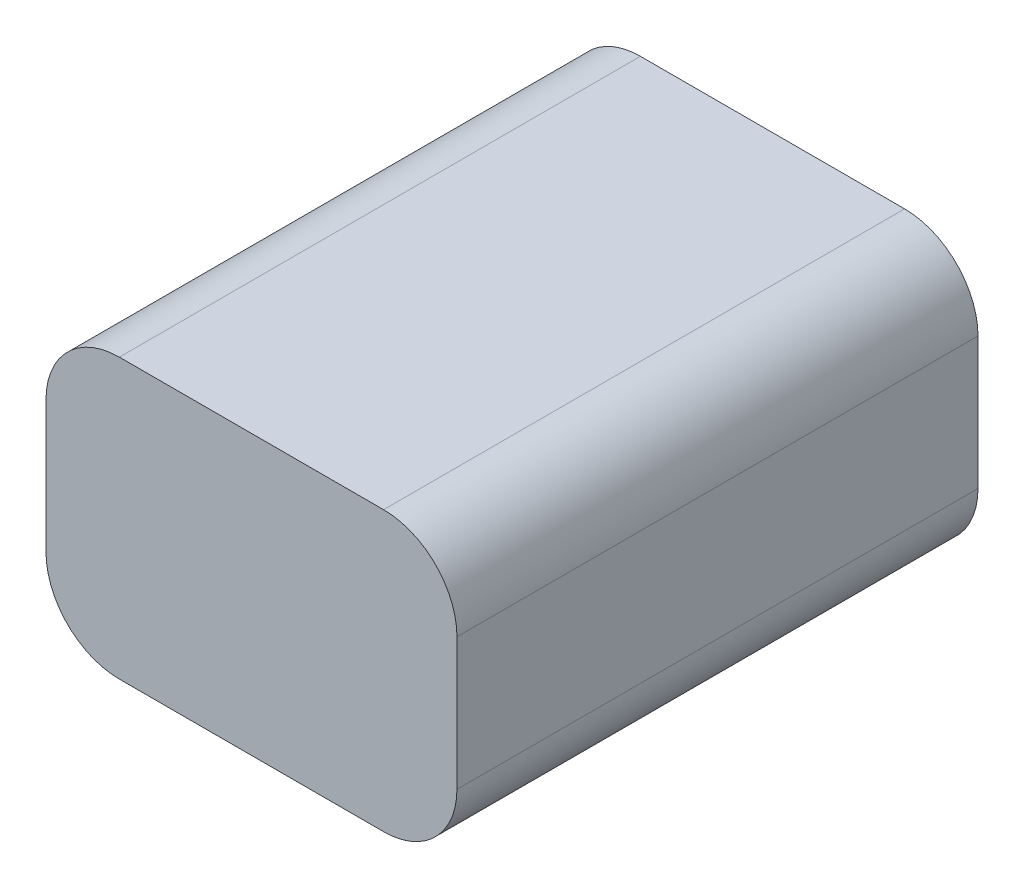
ISO-10303-21;
HEADER;
FILE_DESCRIPTION(('STEP AP214'),'2;1');
FILE_NAME('part.step','',(''),(''),'','','');
FILE_SCHEMA(('AUTOMOTIVE_DESIGN { 1 0 10303 214 1 1 1 1 }'));
ENDSEC;
DATA;
#1=APPLICATION_CONTEXT('core data for automotive mechanical design processes');
#2=APPLICATION_PROTOCOL_DEFINITION('international standard','automotive_design',2000,#1);
#3=PRODUCT_CONTEXT('',#1,'mechanical');
#4=PRODUCT('Part','Part','',(#3));
#5=PRODUCT_RELATED_PRODUCT_CATEGORY('part','',(#4));
#6=PRODUCT_DEFINITION_FORMATION('','',#4);
#7=PRODUCT_DEFINITION_CONTEXT('part definition',#1,'design');
#8=PRODUCT_DEFINITION('design','',#6,#7);
#9=PRODUCT_DEFINITION_SHAPE('','',#8);
#10=(LENGTH_UNIT() NAMED_UNIT(*) SI_UNIT(.MILLI.,.METRE.));
#11=(NAMED_UNIT(*) PLANE_ANGLE_UNIT() SI_UNIT($,.RADIAN.));
#12=(NAMED_UNIT(*) SI_UNIT($,.STERADIAN.) SOLID_ANGLE_UNIT());
#13=UNCERTAINTY_MEASURE_WITH_UNIT(LENGTH_MEASURE(1.E-05),#10,'distance_accuracy_value','');
#14=(GEOMETRIC_REPRESENTATION_CONTEXT(3) GLOBAL_UNCERTAINTY_ASSIGNED_CONTEXT((#13)) GLOBAL_UNIT_ASSIGNED_CONTEXT((#10,
#11,#12)) REPRESENTATION_CONTEXT('',''));
#15=CARTESIAN_POINT('',(0.,0.,0.));
#16=DIRECTION('',(0.,0.,1.));
#17=DIRECTION('',(1.,0.,0.));
#18=AXIS2_PLACEMENT_3D('',#15,#16,#17);
#19=CARTESIAN_POINT('',(0.,0.,71.));
#20=DIRECTION('',(1.,0.,0.));
#21=DIRECTION('',(0.,0.,-1.));
#22=AXIS2_PLACEMENT_3D('',#19,#20,#21);
#23=PLANE('',#22);
#24=DIRECTION('',(0.,-1.,0.));
#25=VECTOR('',#24,1.);
#26=CARTESIAN_POINT('',(0.,0.,0.));
#27=LINE('',#26,#25);
#28=CARTESIAN_POINT('',(0.,28.,0.));
#29=VERTEX_POINT('',#28);
#30=CARTESIAN_POINT('',(0.,10.,0.));
#31=VERTEX_POINT('',#30);
#32=EDGE_CURVE('E136',#29,#31,#27,.T.);
#33=ORIENTED_EDGE('',*,*,#32,.T.);
#34=DIRECTION('',(0.,0.,-1.));
#35=VECTOR('',#34,1.);
#36=CARTESIAN_POINT('',(0.,10.,71.));
#37=LINE('',#36,#35);
#38=CARTESIAN_POINT('',(0.,10.,71.));
#39=VERTEX_POINT('',#38);
#40=EDGE_CURVE('E159',#31,#39,#37,.F.);
#41=ORIENTED_EDGE('',*,*,#40,.T.);
#42=DIRECTION('',(0.,-1.,0.));
#43=VECTOR('',#42,1.);
#44=CARTESIAN_POINT('',(0.,0.,71.));
#45=LINE('',#44,#43);
#46=CARTESIAN_POINT('',(0.,28.,71.));
#47=VERTEX_POINT('',#46);
#48=EDGE_CURVE('E134',#47,#39,#45,.T.);
#49=ORIENTED_EDGE('',*,*,#48,.F.);
#50=DIRECTION('',(0.,0.,-1.));
#51=VECTOR('',#50,1.);
#52=CARTESIAN_POINT('',(0.,28.,71.));
#53=LINE('',#52,#51);
#54=EDGE_CURVE('E156',#47,#29,#53,.T.);
#55=ORIENTED_EDGE('',*,*,#54,.T.);
#56=EDGE_LOOP('',(#33,#41,#49,#55));
#57=FACE_BOUND('',#56,.T.);
#58=ADVANCED_FACE('F41',(#57),#23,.F.);
#59=CARTESIAN_POINT('',(0.,0.,71.));
#60=DIRECTION('',(0.,1.,0.));
#61=DIRECTION('',(0.,0.,1.));
#62=AXIS2_PLACEMENT_3D('',#59,#60,#61);
#63=PLANE('',#62);
#64=DIRECTION('',(1.,0.,0.));
#65=VECTOR('',#64,1.);
#66=CARTESIAN_POINT('',(0.,0.,0.));
#67=LINE('',#66,#65);
#68=CARTESIAN_POINT('',(10.,0.,0.));
#69=VERTEX_POINT('',#68);
#70=CARTESIAN_POINT('',(46.,0.,0.));
#71=VERTEX_POINT('',#70);
#72=EDGE_CURVE('E132',#69,#71,#67,.T.);
#73=ORIENTED_EDGE('',*,*,#72,.T.);
#74=DIRECTION('',(0.,0.,-1.));
#75=VECTOR('',#74,1.);
#76=CARTESIAN_POINT('',(46.,0.,71.));
#77=LINE('',#76,#75);
#78=CARTESIAN_POINT('',(46.,0.,71.));
#79=VERTEX_POINT('',#78);
#80=EDGE_CURVE('E111',#71,#79,#77,.F.);
#81=ORIENTED_EDGE('',*,*,#80,.T.);
#82=DIRECTION('',(1.,0.,0.));
#83=VECTOR('',#82,1.);
#84=CARTESIAN_POINT('',(0.,0.,71.));
#85=LINE('',#84,#83);
#86=CARTESIAN_POINT('',(10.,0.,71.));
#87=VERTEX_POINT('',#86);
#88=EDGE_CURVE('E175',#87,#79,#85,.T.);
#89=ORIENTED_EDGE('',*,*,#88,.F.);
#90=DIRECTION('',(0.,0.,-1.));
#91=VECTOR('',#90,1.);
#92=CARTESIAN_POINT('',(10.,0.,71.));
#93=LINE('',#92,#91);
#94=EDGE_CURVE('E116',#87,#69,#93,.T.);
#95=ORIENTED_EDGE('',*,*,#94,.T.);
#96=EDGE_LOOP('',(#73,#81,#89,#95));
#97=FACE_BOUND('',#96,.T.);
#98=ADVANCED_FACE('F192',(#97),#63,.F.);
#99=CARTESIAN_POINT('',(56.,0.,71.));
#100=DIRECTION('',(-1.,0.,0.));
#101=DIRECTION('',(0.,0.,1.));
#102=AXIS2_PLACEMENT_3D('',#99,#100,#101);
#103=PLANE('',#102);
#104=DIRECTION('',(0.,1.,0.));
#105=VECTOR('',#104,1.);
#106=CARTESIAN_POINT('',(56.,0.,71.));
#107=LINE('',#106,#105);
#108=CARTESIAN_POINT('',(56.,10.,71.));
#109=VERTEX_POINT('',#108);
#110=CARTESIAN_POINT('',(56.,28.,71.));
#111=VERTEX_POINT('',#110);
#112=EDGE_CURVE('E125',#109,#111,#107,.T.);
#113=ORIENTED_EDGE('',*,*,#112,.F.);
#114=DIRECTION('',(0.,0.,-1.));
#115=VECTOR('',#114,1.);
#116=CARTESIAN_POINT('',(56.,10.,71.));
#117=LINE('',#116,#115);
#118=CARTESIAN_POINT('',(56.,10.,0.));
#119=VERTEX_POINT('',#118);
#120=EDGE_CURVE('E110',#109,#119,#117,.T.);
#121=ORIENTED_EDGE('',*,*,#120,.T.);
#122=DIRECTION('',(0.,1.,0.));
#123=VECTOR('',#122,1.);
#124=CARTESIAN_POINT('',(56.,0.,0.));
#125=LINE('',#124,#123);
#126=CARTESIAN_POINT('',(56.,28.,0.));
#127=VERTEX_POINT('',#126);
#128=EDGE_CURVE('E123',#119,#127,#125,.T.);
#129=ORIENTED_EDGE('',*,*,#128,.T.);
#130=DIRECTION('',(0.,0.,-1.));
#131=VECTOR('',#130,1.);
#132=CARTESIAN_POINT('',(56.,28.,71.));
#133=LINE('',#132,#131);
#134=EDGE_CURVE('E127',#127,#111,#133,.F.);
#135=ORIENTED_EDGE('',*,*,#134,.T.);
#136=EDGE_LOOP('',(#113,#121,#129,#135));
#137=FACE_BOUND('',#136,.T.);
#138=ADVANCED_FACE('F122',(#137),#103,.F.);
#139=CARTESIAN_POINT('',(0.,38.,71.));
#140=DIRECTION('',(0.,-1.,0.));
#141=DIRECTION('',(0.,0.,-1.));
#142=AXIS2_PLACEMENT_3D('',#139,#140,#141);
#143=PLANE('',#142);
#144=DIRECTION('',(-1.,0.,0.));
#145=VECTOR('',#144,1.);
#146=CARTESIAN_POINT('',(0.,38.,0.));
#147=LINE('',#146,#145);
#148=CARTESIAN_POINT('',(46.,38.,0.));
#149=VERTEX_POINT('',#148);
#150=CARTESIAN_POINT('',(10.,38.,0.));
#151=VERTEX_POINT('',#150);
#152=EDGE_CURVE('E131',#149,#151,#147,.T.);
#153=ORIENTED_EDGE('',*,*,#152,.T.);
#154=DIRECTION('',(0.,0.,-1.));
#155=VECTOR('',#154,1.);
#156=CARTESIAN_POINT('',(10.,38.,71.));
#157=LINE('',#156,#155);
#158=CARTESIAN_POINT('',(10.,38.,71.));
#159=VERTEX_POINT('',#158);
#160=EDGE_CURVE('E11',#151,#159,#157,.F.);
#161=ORIENTED_EDGE('',*,*,#160,.T.);
#162=DIRECTION('',(-1.,0.,0.));
#163=VECTOR('',#162,1.);
#164=CARTESIAN_POINT('',(0.,38.,71.));
#165=LINE('',#164,#163);
#166=CARTESIAN_POINT('',(46.,38.,71.));
#167=VERTEX_POINT('',#166);
#168=EDGE_CURVE('E140',#167,#159,#165,.T.);
#169=ORIENTED_EDGE('',*,*,#168,.F.);
#170=DIRECTION('',(0.,0.,-1.));
#171=VECTOR('',#170,1.);
#172=CARTESIAN_POINT('',(46.,38.,71.));
#173=LINE('',#172,#171);
#174=EDGE_CURVE('E49',#167,#149,#173,.T.);
#175=ORIENTED_EDGE('',*,*,#174,.T.);
#176=EDGE_LOOP('',(#153,#161,#169,#175));
#177=FACE_BOUND('',#176,.T.);
#178=ADVANCED_FACE('F162',(#177),#143,.F.);
#179=CARTESIAN_POINT('',(0.,0.,71.));
#180=DIRECTION('',(0.,0.,-1.));
#181=DIRECTION('',(-1.,0.,0.));
#182=AXIS2_PLACEMENT_3D('',#179,#180,#181);
#183=PLANE('',#182);
#184=ORIENTED_EDGE('',*,*,#88,.T.);
#185=CARTESIAN_POINT('',(46.,10.,71.));
#186=DIRECTION('',(0.,0.,-1.));
#187=DIRECTION('',(-1.,0.,0.));
#188=AXIS2_PLACEMENT_3D('',#185,#186,#187);
#189=CIRCLE('',#188,10.);
#190=EDGE_CURVE('E154',#79,#109,#189,.F.);
#191=ORIENTED_EDGE('',*,*,#190,.T.);
#192=ORIENTED_EDGE('',*,*,#112,.T.);
#193=CARTESIAN_POINT('',(46.,28.,71.));
#194=DIRECTION('',(0.,0.,-1.));
#195=DIRECTION('',(-1.,0.,0.));
#196=AXIS2_PLACEMENT_3D('',#193,#194,#195);
#197=CIRCLE('',#196,10.);
#198=EDGE_CURVE('E61',#111,#167,#197,.F.);
#199=ORIENTED_EDGE('',*,*,#198,.T.);
#200=ORIENTED_EDGE('',*,*,#168,.T.);
#201=CARTESIAN_POINT('',(10.,28.,71.));
#202=DIRECTION('',(0.,0.,-1.));
#203=DIRECTION('',(-1.,0.,0.));
#204=AXIS2_PLACEMENT_3D('',#201,#202,#203);
#205=CIRCLE('',#204,10.);
#206=EDGE_CURVE('E150',#159,#47,#205,.F.);
#207=ORIENTED_EDGE('',*,*,#206,.T.);
#208=ORIENTED_EDGE('',*,*,#48,.T.);
#209=CARTESIAN_POINT('',(10.,10.,71.));
#210=DIRECTION('',(0.,0.,-1.));
#211=DIRECTION('',(-1.,0.,0.));
#212=AXIS2_PLACEMENT_3D('',#209,#210,#211);
#213=CIRCLE('',#212,10.);
#214=EDGE_CURVE('E152',#39,#87,#213,.F.);
#215=ORIENTED_EDGE('',*,*,#214,.T.);
#216=EDGE_LOOP('',(#184,#191,#192,#199,#200,#207,#208,#215));
#217=FACE_BOUND('',#216,.T.);
#218=ADVANCED_FACE('F181',(#217),#183,.F.);
#219=CARTESIAN_POINT('',(0.,0.,0.));
#220=DIRECTION('',(0.,0.,-1.));
#221=DIRECTION('',(-1.,0.,0.));
#222=AXIS2_PLACEMENT_3D('',#219,#220,#221);
#223=PLANE('',#222);
#224=ORIENTED_EDGE('',*,*,#128,.F.);
#225=CARTESIAN_POINT('',(46.,10.,0.));
#226=DIRECTION('',(0.,0.,-1.));
#227=DIRECTION('',(-1.,0.,0.));
#228=AXIS2_PLACEMENT_3D('',#225,#226,#227);
#229=CIRCLE('',#228,10.);
#230=EDGE_CURVE('E106',#119,#71,#229,.T.);
#231=ORIENTED_EDGE('',*,*,#230,.T.);
#232=ORIENTED_EDGE('',*,*,#72,.F.);
#233=CARTESIAN_POINT('',(10.,10.,0.));
#234=DIRECTION('',(0.,0.,-1.));
#235=DIRECTION('',(-1.,0.,0.));
#236=AXIS2_PLACEMENT_3D('',#233,#234,#235);
#237=CIRCLE('',#236,10.);
#238=EDGE_CURVE('E117',#69,#31,#237,.T.);
#239=ORIENTED_EDGE('',*,*,#238,.T.);
#240=ORIENTED_EDGE('',*,*,#32,.F.);
#241=CARTESIAN_POINT('',(10.,28.,0.));
#242=DIRECTION('',(0.,0.,-1.));
#243=DIRECTION('',(-1.,0.,0.));
#244=AXIS2_PLACEMENT_3D('',#241,#242,#243);
#245=CIRCLE('',#244,10.);
#246=EDGE_CURVE('E143',#29,#151,#245,.T.);
#247=ORIENTED_EDGE('',*,*,#246,.T.);
#248=ORIENTED_EDGE('',*,*,#152,.F.);
#249=CARTESIAN_POINT('',(46.,28.,0.));
#250=DIRECTION('',(0.,0.,-1.));
#251=DIRECTION('',(-1.,0.,0.));
#252=AXIS2_PLACEMENT_3D('',#249,#250,#251);
#253=CIRCLE('',#252,10.);
#254=EDGE_CURVE('E126',#149,#127,#253,.T.);
#255=ORIENTED_EDGE('',*,*,#254,.T.);
#256=EDGE_LOOP('',(#224,#231,#232,#239,#240,#247,#248,#255));
#257=FACE_BOUND('',#256,.T.);
#258=ADVANCED_FACE('F129',(#257),#223,.T.);
#259=CARTESIAN_POINT('',(46.,10.,71.));
#260=DIRECTION('',(0.,0.,-1.));
#261=DIRECTION('',(-1.,0.,0.));
#262=AXIS2_PLACEMENT_3D('',#259,#260,#261);
#263=CYLINDRICAL_SURFACE('',#262,10.);
#264=ORIENTED_EDGE('',*,*,#190,.F.);
#265=ORIENTED_EDGE('',*,*,#80,.F.);
#266=ORIENTED_EDGE('',*,*,#230,.F.);
#267=ORIENTED_EDGE('',*,*,#120,.F.);
#268=EDGE_LOOP('',(#264,#265,#266,#267));
#269=FACE_BOUND('',#268,.T.);
#270=ADVANCED_FACE('F109',(#269),#263,.T.);
#271=CARTESIAN_POINT('',(10.,10.,71.));
#272=DIRECTION('',(0.,0.,-1.));
#273=DIRECTION('',(-1.,0.,0.));
#274=AXIS2_PLACEMENT_3D('',#271,#272,#273);
#275=CYLINDRICAL_SURFACE('',#274,10.);
#276=ORIENTED_EDGE('',*,*,#214,.F.);
#277=ORIENTED_EDGE('',*,*,#40,.F.);
#278=ORIENTED_EDGE('',*,*,#238,.F.);
#279=ORIENTED_EDGE('',*,*,#94,.F.);
#280=EDGE_LOOP('',(#276,#277,#278,#279));
#281=FACE_BOUND('',#280,.T.);
#282=ADVANCED_FACE('F203',(#281),#275,.T.);
#283=CARTESIAN_POINT('',(10.,28.,71.));
#284=DIRECTION('',(0.,0.,-1.));
#285=DIRECTION('',(-1.,0.,0.));
#286=AXIS2_PLACEMENT_3D('',#283,#284,#285);
#287=CYLINDRICAL_SURFACE('',#286,10.);
#288=ORIENTED_EDGE('',*,*,#206,.F.);
#289=ORIENTED_EDGE('',*,*,#160,.F.);
#290=ORIENTED_EDGE('',*,*,#246,.F.);
#291=ORIENTED_EDGE('',*,*,#54,.F.);
#292=EDGE_LOOP('',(#288,#289,#290,#291));
#293=FACE_BOUND('',#292,.T.);
#294=ADVANCED_FACE('F169',(#293),#287,.T.);
#295=CARTESIAN_POINT('',(46.,28.,71.));
#296=DIRECTION('',(0.,0.,-1.));
#297=DIRECTION('',(-1.,0.,0.));
#298=AXIS2_PLACEMENT_3D('',#295,#296,#297);
#299=CYLINDRICAL_SURFACE('',#298,10.);
#300=ORIENTED_EDGE('',*,*,#198,.F.);
#301=ORIENTED_EDGE('',*,*,#134,.F.);
#302=ORIENTED_EDGE('',*,*,#254,.F.);
#303=ORIENTED_EDGE('',*,*,#174,.F.);
#304=EDGE_LOOP('',(#300,#301,#302,#303));
#305=FACE_BOUND('',#304,.T.);
#306=ADVANCED_FACE('F43',(#305),#299,.T.);
#307=CLOSED_SHELL('',(#58,#98,#138,#178,#218,#258,#270,#282,#294,#306));
#308=MANIFOLD_SOLID_BREP('B2',#307);
#309=ADVANCED_BREP_SHAPE_REPRESENTATION('',(#18,#308),#14);
#310=SHAPE_DEFINITION_REPRESENTATION(#9,#309);
ENDSEC;
END-ISO-10303-21;
